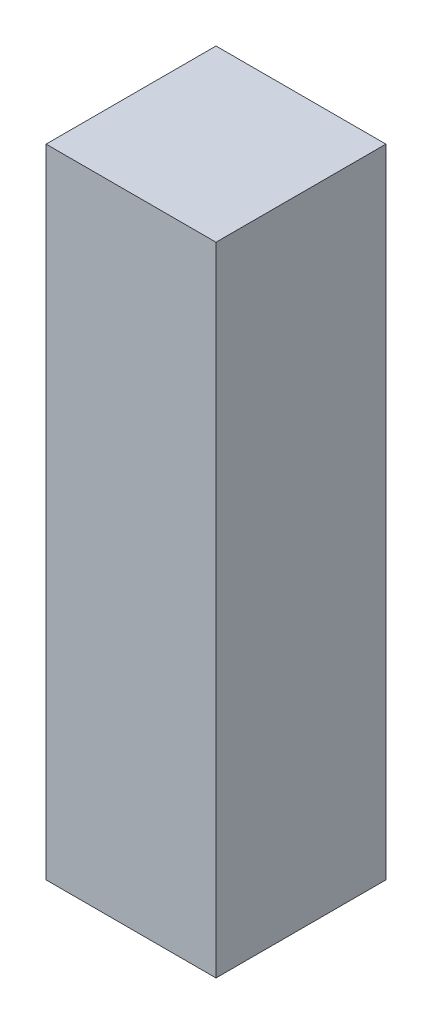
ISO-10303-21;
HEADER;
FILE_DESCRIPTION(('STEP AP214'),'2;1');
FILE_NAME('part.step','',(''),(''),'','','');
FILE_SCHEMA(('AUTOMOTIVE_DESIGN { 1 0 10303 214 1 1 1 1 }'));
ENDSEC;
DATA;
#1=APPLICATION_CONTEXT('core data for automotive mechanical design processes');
#2=APPLICATION_PROTOCOL_DEFINITION('international standard','automotive_design',2000,#1);
#3=PRODUCT_CONTEXT('',#1,'mechanical');
#4=PRODUCT('Part','Part','',(#3));
#5=PRODUCT_RELATED_PRODUCT_CATEGORY('part','',(#4));
#6=PRODUCT_DEFINITION_FORMATION('','',#4);
#7=PRODUCT_DEFINITION_CONTEXT('part definition',#1,'design');
#8=PRODUCT_DEFINITION('design','',#6,#7);
#9=PRODUCT_DEFINITION_SHAPE('','',#8);
#10=(LENGTH_UNIT() NAMED_UNIT(*) SI_UNIT(.MILLI.,.METRE.));
#11=(NAMED_UNIT(*) PLANE_ANGLE_UNIT() SI_UNIT($,.RADIAN.));
#12=(NAMED_UNIT(*) SI_UNIT($,.STERADIAN.) SOLID_ANGLE_UNIT());
#13=UNCERTAINTY_MEASURE_WITH_UNIT(LENGTH_MEASURE(1.E-05),#10,'distance_accuracy_value','');
#14=(GEOMETRIC_REPRESENTATION_CONTEXT(3) GLOBAL_UNCERTAINTY_ASSIGNED_CONTEXT((#13)) GLOBAL_UNIT_ASSIGNED_CONTEXT((#10,
#11,#12)) REPRESENTATION_CONTEXT('',''));
#15=CARTESIAN_POINT('',(0.,0.,0.));
#16=DIRECTION('',(0.,0.,1.));
#17=DIRECTION('',(1.,0.,0.));
#18=AXIS2_PLACEMENT_3D('',#15,#16,#17);
#19=CARTESIAN_POINT('',(4.,30.,4.));
#20=DIRECTION('',(-1.,0.,0.));
#21=DIRECTION('',(0.,0.,1.));
#22=AXIS2_PLACEMENT_3D('',#19,#20,#21);
#23=PLANE('',#22);
#24=DIRECTION('',(0.,0.,-1.));
#25=VECTOR('',#24,1.);
#26=CARTESIAN_POINT('',(4.,0.,4.));
#27=LINE('',#26,#25);
#28=CARTESIAN_POINT('',(4.,0.,4.));
#29=VERTEX_POINT('',#28);
#30=CARTESIAN_POINT('',(4.,0.,-4.));
#31=VERTEX_POINT('',#30);
#32=EDGE_CURVE('E102',#29,#31,#27,.T.);
#33=ORIENTED_EDGE('',*,*,#32,.T.);
#34=DIRECTION('',(0.,-1.,0.));
#35=VECTOR('',#34,1.);
#36=CARTESIAN_POINT('',(4.,30.,-4.));
#37=LINE('',#36,#35);
#38=CARTESIAN_POINT('',(4.,30.,-4.));
#39=VERTEX_POINT('',#38);
#40=EDGE_CURVE('E11',#39,#31,#37,.T.);
#41=ORIENTED_EDGE('',*,*,#40,.F.);
#42=DIRECTION('',(0.,0.,-1.));
#43=VECTOR('',#42,1.);
#44=CARTESIAN_POINT('',(4.,30.,4.));
#45=LINE('',#44,#43);
#46=CARTESIAN_POINT('',(4.,30.,4.));
#47=VERTEX_POINT('',#46);
#48=EDGE_CURVE('E90',#47,#39,#45,.T.);
#49=ORIENTED_EDGE('',*,*,#48,.F.);
#50=DIRECTION('',(0.,-1.,0.));
#51=VECTOR('',#50,1.);
#52=CARTESIAN_POINT('',(4.,30.,4.));
#53=LINE('',#52,#51);
#54=EDGE_CURVE('E98',#47,#29,#53,.T.);
#55=ORIENTED_EDGE('',*,*,#54,.T.);
#56=EDGE_LOOP('',(#33,#41,#49,#55));
#57=FACE_BOUND('',#56,.T.);
#58=ADVANCED_FACE('F39',(#57),#23,.F.);
#59=CARTESIAN_POINT('',(-4.,30.,-4.));
#60=DIRECTION('',(0.,0.,1.));
#61=DIRECTION('',(1.,0.,0.));
#62=AXIS2_PLACEMENT_3D('',#59,#60,#61);
#63=PLANE('',#62);
#64=DIRECTION('',(-1.,0.,0.));
#65=VECTOR('',#64,1.);
#66=CARTESIAN_POINT('',(-4.,0.,-4.));
#67=LINE('',#66,#65);
#68=CARTESIAN_POINT('',(-4.,0.,-4.));
#69=VERTEX_POINT('',#68);
#70=EDGE_CURVE('E94',#31,#69,#67,.T.);
#71=ORIENTED_EDGE('',*,*,#70,.T.);
#72=DIRECTION('',(0.,-1.,0.));
#73=VECTOR('',#72,1.);
#74=CARTESIAN_POINT('',(-4.,30.,-4.));
#75=LINE('',#74,#73);
#76=CARTESIAN_POINT('',(-4.,30.,-4.));
#77=VERTEX_POINT('',#76);
#78=EDGE_CURVE('E47',#77,#69,#75,.T.);
#79=ORIENTED_EDGE('',*,*,#78,.F.);
#80=DIRECTION('',(-1.,0.,0.));
#81=VECTOR('',#80,1.);
#82=CARTESIAN_POINT('',(-4.,30.,-4.));
#83=LINE('',#82,#81);
#84=EDGE_CURVE('E85',#39,#77,#83,.T.);
#85=ORIENTED_EDGE('',*,*,#84,.F.);
#86=ORIENTED_EDGE('',*,*,#40,.T.);
#87=EDGE_LOOP('',(#71,#79,#85,#86));
#88=FACE_BOUND('',#87,.T.);
#89=ADVANCED_FACE('F93',(#88),#63,.F.);
#90=CARTESIAN_POINT('',(-4.,30.,4.));
#91=DIRECTION('',(1.,0.,0.));
#92=DIRECTION('',(0.,0.,-1.));
#93=AXIS2_PLACEMENT_3D('',#90,#91,#92);
#94=PLANE('',#93);
#95=DIRECTION('',(0.,0.,1.));
#96=VECTOR('',#95,1.);
#97=CARTESIAN_POINT('',(-4.,0.,4.));
#98=LINE('',#97,#96);
#99=CARTESIAN_POINT('',(-4.,0.,4.));
#100=VERTEX_POINT('',#99);
#101=EDGE_CURVE('E72',#69,#100,#98,.T.);
#102=ORIENTED_EDGE('',*,*,#101,.T.);
#103=DIRECTION('',(0.,-1.,0.));
#104=VECTOR('',#103,1.);
#105=CARTESIAN_POINT('',(-4.,30.,4.));
#106=LINE('',#105,#104);
#107=CARTESIAN_POINT('',(-4.,30.,4.));
#108=VERTEX_POINT('',#107);
#109=EDGE_CURVE('E95',#108,#100,#106,.T.);
#110=ORIENTED_EDGE('',*,*,#109,.F.);
#111=DIRECTION('',(0.,0.,1.));
#112=VECTOR('',#111,1.);
#113=CARTESIAN_POINT('',(-4.,30.,4.));
#114=LINE('',#113,#112);
#115=EDGE_CURVE('E88',#77,#108,#114,.T.);
#116=ORIENTED_EDGE('',*,*,#115,.F.);
#117=ORIENTED_EDGE('',*,*,#78,.T.);
#118=EDGE_LOOP('',(#102,#110,#116,#117));
#119=FACE_BOUND('',#118,.T.);
#120=ADVANCED_FACE('F96',(#119),#94,.F.);
#121=CARTESIAN_POINT('',(-4.,30.,4.));
#122=DIRECTION('',(0.,0.,-1.));
#123=DIRECTION('',(-1.,0.,0.));
#124=AXIS2_PLACEMENT_3D('',#121,#122,#123);
#125=PLANE('',#124);
#126=DIRECTION('',(1.,0.,0.));
#127=VECTOR('',#126,1.);
#128=CARTESIAN_POINT('',(-4.,0.,4.));
#129=LINE('',#128,#127);
#130=EDGE_CURVE('E78',#100,#29,#129,.T.);
#131=ORIENTED_EDGE('',*,*,#130,.T.);
#132=ORIENTED_EDGE('',*,*,#54,.F.);
#133=DIRECTION('',(1.,0.,0.));
#134=VECTOR('',#133,1.);
#135=CARTESIAN_POINT('',(-4.,30.,4.));
#136=LINE('',#135,#134);
#137=EDGE_CURVE('E55',#108,#47,#136,.T.);
#138=ORIENTED_EDGE('',*,*,#137,.F.);
#139=ORIENTED_EDGE('',*,*,#109,.T.);
#140=EDGE_LOOP('',(#131,#132,#138,#139));
#141=FACE_BOUND('',#140,.T.);
#142=ADVANCED_FACE('F109',(#141),#125,.F.);
#143=CARTESIAN_POINT('',(0.,30.,0.));
#144=DIRECTION('',(0.,-1.,0.));
#145=DIRECTION('',(0.,0.,-1.));
#146=AXIS2_PLACEMENT_3D('',#143,#144,#145);
#147=PLANE('',#146);
#148=ORIENTED_EDGE('',*,*,#48,.T.);
#149=ORIENTED_EDGE('',*,*,#84,.T.);
#150=ORIENTED_EDGE('',*,*,#115,.T.);
#151=ORIENTED_EDGE('',*,*,#137,.T.);
#152=EDGE_LOOP('',(#148,#149,#150,#151));
#153=FACE_BOUND('',#152,.T.);
#154=ADVANCED_FACE('F86',(#153),#147,.F.);
#155=CARTESIAN_POINT('',(0.,0.,0.));
#156=DIRECTION('',(0.,-1.,0.));
#157=DIRECTION('',(0.,0.,-1.));
#158=AXIS2_PLACEMENT_3D('',#155,#156,#157);
#159=PLANE('',#158);
#160=ORIENTED_EDGE('',*,*,#32,.F.);
#161=ORIENTED_EDGE('',*,*,#130,.F.);
#162=ORIENTED_EDGE('',*,*,#101,.F.);
#163=ORIENTED_EDGE('',*,*,#70,.F.);
#164=EDGE_LOOP('',(#160,#161,#162,#163));
#165=FACE_BOUND('',#164,.T.);
#166=ADVANCED_FACE('F112',(#165),#159,.T.);
#167=CLOSED_SHELL('',(#58,#89,#120,#142,#154,#166));
#168=MANIFOLD_SOLID_BREP('B2',#167);
#169=ADVANCED_BREP_SHAPE_REPRESENTATION('',(#18,#168),#14);
#170=SHAPE_DEFINITION_REPRESENTATION(#9,#169);
ENDSEC;
END-ISO-10303-21;
